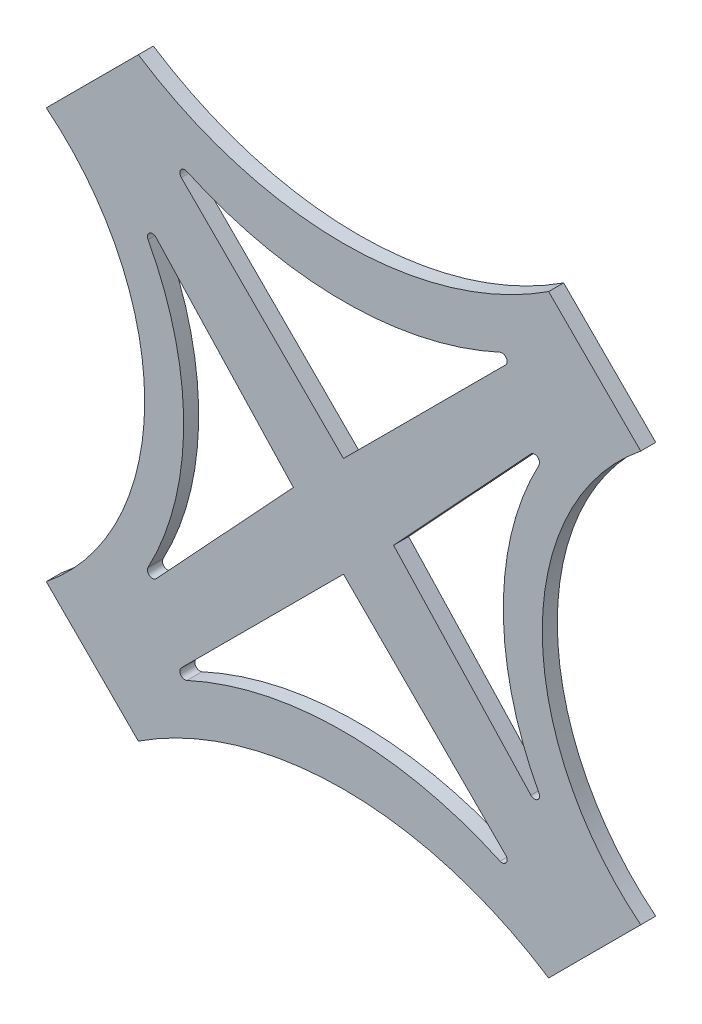
ISO-10303-21;
HEADER;
FILE_DESCRIPTION(('STEP AP214'),'2;1');
FILE_NAME('part.step','',(''),(''),'','','');
FILE_SCHEMA(('AUTOMOTIVE_DESIGN { 1 0 10303 214 1 1 1 1 }'));
ENDSEC;
DATA;
#1=APPLICATION_CONTEXT('core data for automotive mechanical design processes');
#2=APPLICATION_PROTOCOL_DEFINITION('international standard','automotive_design',2000,#1);
#3=PRODUCT_CONTEXT('',#1,'mechanical');
#4=PRODUCT('Part','Part','',(#3));
#5=PRODUCT_RELATED_PRODUCT_CATEGORY('part','',(#4));
#6=PRODUCT_DEFINITION_FORMATION('','',#4);
#7=PRODUCT_DEFINITION_CONTEXT('part definition',#1,'design');
#8=PRODUCT_DEFINITION('design','',#6,#7);
#9=PRODUCT_DEFINITION_SHAPE('','',#8);
#10=(LENGTH_UNIT() NAMED_UNIT(*) SI_UNIT(.MILLI.,.METRE.));
#11=(NAMED_UNIT(*) PLANE_ANGLE_UNIT() SI_UNIT($,.RADIAN.));
#12=(NAMED_UNIT(*) SI_UNIT($,.STERADIAN.) SOLID_ANGLE_UNIT());
#13=UNCERTAINTY_MEASURE_WITH_UNIT(LENGTH_MEASURE(1.E-05),#10,'distance_accuracy_value','');
#14=(GEOMETRIC_REPRESENTATION_CONTEXT(3) GLOBAL_UNCERTAINTY_ASSIGNED_CONTEXT((#13)) GLOBAL_UNIT_ASSIGNED_CONTEXT((#10,
#11,#12)) REPRESENTATION_CONTEXT('',''));
#15=CARTESIAN_POINT('',(0.,0.,0.));
#16=DIRECTION('',(0.,0.,1.));
#17=DIRECTION('',(1.,0.,0.));
#18=AXIS2_PLACEMENT_3D('',#15,#16,#17);
#19=CARTESIAN_POINT('',(-92.1866433585992,0.,3.));
#20=DIRECTION('',(0.,0.,-1.));
#21=DIRECTION('',(-1.,0.,0.));
#22=AXIS2_PLACEMENT_3D('',#19,#20,#21);
#23=PLANE('',#22);
#24=CARTESIAN_POINT('',(-31.6693853715981,-43.0835989339711,3.));
#25=DIRECTION('',(0.,0.,1.));
#26=DIRECTION('',(1.,0.,0.));
#27=AXIS2_PLACEMENT_3D('',#24,#25,#26);
#28=CIRCLE('',#27,1.);
#29=CARTESIAN_POINT('',(-32.3764921527847,-42.3764921527845,3.));
#30=VERTEX_POINT('',#29);
#31=CARTESIAN_POINT('',(-31.2526829324982,-43.9926418797377,3.));
#32=VERTEX_POINT('',#31);
#33=EDGE_CURVE('E272',#30,#32,#28,.T.);
#34=ORIENTED_EDGE('',*,*,#33,.F.);
#35=DIRECTION('',(-0.70710678118655,-0.707106781186545,0.));
#36=VECTOR('',#35,1.);
#37=CARTESIAN_POINT('',(-32.3764921527847,-42.3764921527845,3.));
#38=LINE('',#37,#36);
#39=CARTESIAN_POINT('',(0.,-10.,3.));
#40=VERTEX_POINT('',#39);
#41=EDGE_CURVE('E282',#40,#30,#38,.T.);
#42=ORIENTED_EDGE('',*,*,#41,.F.);
#43=DIRECTION('',(-0.707106781186543,0.707106781186552,0.));
#44=VECTOR('',#43,1.);
#45=CARTESIAN_POINT('',(0.,-10.,3.));
#46=LINE('',#45,#44);
#47=CARTESIAN_POINT('',(32.3764921527839,-42.3764921527843,3.));
#48=VERTEX_POINT('',#47);
#49=EDGE_CURVE('E279',#48,#40,#46,.T.);
#50=ORIENTED_EDGE('',*,*,#49,.F.);
#51=CARTESIAN_POINT('',(31.6693853715977,-43.0835989339711,3.));
#52=DIRECTION('',(0.,0.,1.));
#53=DIRECTION('',(1.,0.,0.));
#54=AXIS2_PLACEMENT_3D('',#51,#52,#53);
#55=CIRCLE('',#54,0.999999999999915);
#56=CARTESIAN_POINT('',(31.2526829324974,-43.9926418797375,3.));
#57=VERTEX_POINT('',#56);
#58=EDGE_CURVE('E277',#57,#48,#55,.T.);
#59=ORIENTED_EDGE('',*,*,#58,.F.);
#60=CARTESIAN_POINT('',(-2.24711807462487E-13,-112.170862812238,3.));
#61=DIRECTION('',(0.,0.,-1.));
#62=DIRECTION('',(1.,0.,0.));
#63=AXIS2_PLACEMENT_3D('',#60,#61,#62);
#64=CIRCLE('',#63,75.0000000000001);
#65=EDGE_CURVE('E274',#32,#57,#64,.T.);
#66=ORIENTED_EDGE('',*,*,#65,.F.);
#67=EDGE_LOOP('',(#34,#42,#50,#59,#66));
#68=FACE_BOUND('',#67,.T.);
#69=CARTESIAN_POINT('',(31.6693853715977,43.0835989339711,3.));
#70=DIRECTION('',(0.,0.,1.));
#71=DIRECTION('',(-1.,0.,0.));
#72=AXIS2_PLACEMENT_3D('',#69,#70,#71);
#73=CIRCLE('',#72,0.999999999999915);
#74=CARTESIAN_POINT('',(32.3764921527839,42.3764921527843,3.));
#75=VERTEX_POINT('',#74);
#76=CARTESIAN_POINT('',(31.2526829324974,43.9926418797376,3.));
#77=VERTEX_POINT('',#76);
#78=EDGE_CURVE('E348',#75,#77,#73,.T.);
#79=ORIENTED_EDGE('',*,*,#78,.F.);
#80=DIRECTION('',(0.707106781186543,0.707106781186552,0.));
#81=VECTOR('',#80,1.);
#82=CARTESIAN_POINT('',(0.,10.,3.));
#83=LINE('',#82,#81);
#84=CARTESIAN_POINT('',(0.,10.,3.));
#85=VERTEX_POINT('',#84);
#86=EDGE_CURVE('E358',#85,#75,#83,.T.);
#87=ORIENTED_EDGE('',*,*,#86,.F.);
#88=DIRECTION('',(0.70710678118655,-0.707106781186545,0.));
#89=VECTOR('',#88,1.);
#90=CARTESIAN_POINT('',(-32.3764921527847,42.3764921527845,3.));
#91=LINE('',#90,#89);
#92=CARTESIAN_POINT('',(-32.3764921527846,42.3764921527845,3.));
#93=VERTEX_POINT('',#92);
#94=EDGE_CURVE('E355',#93,#85,#91,.T.);
#95=ORIENTED_EDGE('',*,*,#94,.F.);
#96=CARTESIAN_POINT('',(-31.6693853715981,43.0835989339711,3.));
#97=DIRECTION('',(0.,0.,1.));
#98=DIRECTION('',(-1.,0.,0.));
#99=AXIS2_PLACEMENT_3D('',#96,#97,#98);
#100=CIRCLE('',#99,1.00000000000001);
#101=CARTESIAN_POINT('',(-31.2526829324981,43.9926418797377,3.));
#102=VERTEX_POINT('',#101);
#103=EDGE_CURVE('E353',#102,#93,#100,.T.);
#104=ORIENTED_EDGE('',*,*,#103,.F.);
#105=CARTESIAN_POINT('',(-2.24711807462487E-13,112.170862812238,3.));
#106=DIRECTION('',(0.,0.,-1.));
#107=DIRECTION('',(-1.,0.,0.));
#108=AXIS2_PLACEMENT_3D('',#105,#106,#107);
#109=CIRCLE('',#108,75.0000000000001);
#110=EDGE_CURVE('E350',#77,#102,#109,.T.);
#111=ORIENTED_EDGE('',*,*,#110,.F.);
#112=EDGE_LOOP('',(#79,#87,#95,#104,#111));
#113=FACE_BOUND('',#112,.T.);
#114=CARTESIAN_POINT('',(-92.1866433585992,0.,3.));
#115=DIRECTION('',(0.,0.,-1.));
#116=DIRECTION('',(-1.,0.,0.));
#117=AXIS2_PLACEMENT_3D('',#114,#115,#116);
#118=CIRCLE('',#117,52.5);
#119=CARTESIAN_POINT('',(-59.3410896032044,40.9563132923542,3.));
#120=VERTEX_POINT('',#119);
#121=CARTESIAN_POINT('',(-59.3410896032044,-40.9563132923542,3.));
#122=VERTEX_POINT('',#121);
#123=EDGE_CURVE('E386',#120,#122,#118,.T.);
#124=ORIENTED_EDGE('',*,*,#123,.T.);
#125=DIRECTION('',(0.707106781186547,-0.707106781186547,0.));
#126=VECTOR('',#125,1.);
#127=CARTESIAN_POINT('',(-59.3410896032044,-40.9563132923542,3.));
#128=LINE('',#127,#126);
#129=CARTESIAN_POINT('',(-40.9563132923542,-59.3410896032044,3.));
#130=VERTEX_POINT('',#129);
#131=EDGE_CURVE('E389',#122,#130,#128,.T.);
#132=ORIENTED_EDGE('',*,*,#131,.T.);
#133=CARTESIAN_POINT('',(0.,-122.170862812237,3.));
#134=DIRECTION('',(0.,0.,-1.));
#135=DIRECTION('',(-1.,0.,0.));
#136=AXIS2_PLACEMENT_3D('',#133,#134,#135);
#137=CIRCLE('',#136,75.);
#138=CARTESIAN_POINT('',(40.9563132923542,-59.3410896032043,3.));
#139=VERTEX_POINT('',#138);
#140=EDGE_CURVE('E392',#130,#139,#137,.T.);
#141=ORIENTED_EDGE('',*,*,#140,.T.);
#142=DIRECTION('',(0.707106781186548,0.707106781186547,0.));
#143=VECTOR('',#142,1.);
#144=CARTESIAN_POINT('',(40.9563132923542,-59.3410896032043,3.));
#145=LINE('',#144,#143);
#146=CARTESIAN_POINT('',(59.3410896032044,-40.9563132923541,3.));
#147=VERTEX_POINT('',#146);
#148=EDGE_CURVE('E394',#139,#147,#145,.T.);
#149=ORIENTED_EDGE('',*,*,#148,.T.);
#150=CARTESIAN_POINT('',(92.1866433585992,0.,3.));
#151=DIRECTION('',(0.,0.,-1.));
#152=DIRECTION('',(1.,0.,0.));
#153=AXIS2_PLACEMENT_3D('',#150,#151,#152);
#154=CIRCLE('',#153,52.5);
#155=CARTESIAN_POINT('',(59.3410896032044,40.9563132923541,3.));
#156=VERTEX_POINT('',#155);
#157=EDGE_CURVE('E396',#147,#156,#154,.T.);
#158=ORIENTED_EDGE('',*,*,#157,.T.);
#159=DIRECTION('',(-0.707106781186548,0.707106781186547,0.));
#160=VECTOR('',#159,1.);
#161=CARTESIAN_POINT('',(40.9563132923542,59.3410896032043,3.));
#162=LINE('',#161,#160);
#163=CARTESIAN_POINT('',(40.9563132923541,59.3410896032043,3.));
#164=VERTEX_POINT('',#163);
#165=EDGE_CURVE('E398',#156,#164,#162,.T.);
#166=ORIENTED_EDGE('',*,*,#165,.T.);
#167=CARTESIAN_POINT('',(0.,122.170862812237,3.));
#168=DIRECTION('',(0.,0.,-1.));
#169=DIRECTION('',(1.,0.,0.));
#170=AXIS2_PLACEMENT_3D('',#167,#168,#169);
#171=CIRCLE('',#170,75.);
#172=CARTESIAN_POINT('',(-40.9563132923542,59.3410896032044,3.));
#173=VERTEX_POINT('',#172);
#174=EDGE_CURVE('E400',#164,#173,#171,.T.);
#175=ORIENTED_EDGE('',*,*,#174,.T.);
#176=DIRECTION('',(-0.707106781186547,-0.707106781186547,0.));
#177=VECTOR('',#176,1.);
#178=CARTESIAN_POINT('',(-59.3410896032044,40.9563132923542,3.));
#179=LINE('',#178,#177);
#180=EDGE_CURVE('E402',#173,#120,#179,.T.);
#181=ORIENTED_EDGE('',*,*,#180,.T.);
#182=EDGE_LOOP('',(#124,#132,#141,#149,#158,#166,#175,#181));
#183=FACE_BOUND('',#182,.T.);
#184=DIRECTION('',(0.680734224272991,0.732530488036812,0.));
#185=VECTOR('',#184,1.);
#186=CARTESIAN_POINT('',(-10.,0.,3.));
#187=LINE('',#186,#185);
#188=CARTESIAN_POINT('',(-37.4101351012741,-29.4957399333564,3.));
#189=VERTEX_POINT('',#188);
#190=CARTESIAN_POINT('',(-10.,0.,3.));
#191=VERTEX_POINT('',#190);
#192=EDGE_CURVE('E310',#189,#191,#187,.T.);
#193=ORIENTED_EDGE('',*,*,#192,.F.);
#194=CARTESIAN_POINT('',(-38.1426655893109,-28.8150057090834,3.));
#195=DIRECTION('',(0.,0.,1.));
#196=DIRECTION('',(-1.,0.,0.));
#197=AXIS2_PLACEMENT_3D('',#194,#195,#196);
#198=CIRCLE('',#197,1.00000000000001);
#199=CARTESIAN_POINT('',(-39.0240621147107,-28.3426285663116,3.));
#200=VERTEX_POINT('',#199);
#201=EDGE_CURVE('E320',#200,#189,#198,.T.);
#202=ORIENTED_EDGE('',*,*,#201,.F.);
#203=CARTESIAN_POINT('',(-91.9078536386937,0.,3.));
#204=DIRECTION('',(0.,0.,-1.));
#205=DIRECTION('',(-1.,0.,0.));
#206=AXIS2_PLACEMENT_3D('',#203,#204,#205);
#207=CIRCLE('',#206,60.);
#208=CARTESIAN_POINT('',(-39.0240621147107,28.3426285663116,3.));
#209=VERTEX_POINT('',#208);
#210=EDGE_CURVE('E317',#209,#200,#207,.T.);
#211=ORIENTED_EDGE('',*,*,#210,.F.);
#212=CARTESIAN_POINT('',(-38.1426655893109,28.8150057090834,3.));
#213=DIRECTION('',(0.,0.,1.));
#214=DIRECTION('',(-1.,0.,0.));
#215=AXIS2_PLACEMENT_3D('',#212,#213,#214);
#216=CIRCLE('',#215,1.);
#217=CARTESIAN_POINT('',(-37.4101351012741,29.4957399333564,3.));
#218=VERTEX_POINT('',#217);
#219=EDGE_CURVE('E315',#218,#209,#216,.T.);
#220=ORIENTED_EDGE('',*,*,#219,.F.);
#221=DIRECTION('',(-0.680734224272991,0.732530488036811,0.));
#222=VECTOR('',#221,1.);
#223=CARTESIAN_POINT('',(-37.4101351012741,29.4957399333564,3.));
#224=LINE('',#223,#222);
#225=EDGE_CURVE('E312',#191,#218,#224,.T.);
#226=ORIENTED_EDGE('',*,*,#225,.F.);
#227=EDGE_LOOP('',(#193,#202,#211,#220,#226));
#228=FACE_BOUND('',#227,.T.);
#229=DIRECTION('',(-0.680734224272991,-0.732530488036811,0.));
#230=VECTOR('',#229,1.);
#231=CARTESIAN_POINT('',(37.4101351012741,29.4957399333564,3.));
#232=LINE('',#231,#230);
#233=CARTESIAN_POINT('',(37.4101351012741,29.4957399333564,3.));
#234=VERTEX_POINT('',#233);
#235=CARTESIAN_POINT('',(10.,0.,3.));
#236=VERTEX_POINT('',#235);
#237=EDGE_CURVE('E228',#234,#236,#232,.T.);
#238=ORIENTED_EDGE('',*,*,#237,.F.);
#239=CARTESIAN_POINT('',(38.1426655893109,28.8150057090834,3.));
#240=DIRECTION('',(0.,0.,1.));
#241=DIRECTION('',(1.,0.,0.));
#242=AXIS2_PLACEMENT_3D('',#239,#240,#241);
#243=CIRCLE('',#242,1.);
#244=CARTESIAN_POINT('',(39.0240621147107,28.3426285663116,3.));
#245=VERTEX_POINT('',#244);
#246=EDGE_CURVE('E255',#245,#234,#243,.T.);
#247=ORIENTED_EDGE('',*,*,#246,.F.);
#248=CARTESIAN_POINT('',(91.9078536386937,0.,3.));
#249=DIRECTION('',(0.,0.,-1.));
#250=DIRECTION('',(1.,0.,0.));
#251=AXIS2_PLACEMENT_3D('',#248,#249,#250);
#252=CIRCLE('',#251,60.);
#253=CARTESIAN_POINT('',(39.0240621147107,-28.3426285663116,3.));
#254=VERTEX_POINT('',#253);
#255=EDGE_CURVE('E251',#254,#245,#252,.T.);
#256=ORIENTED_EDGE('',*,*,#255,.F.);
#257=CARTESIAN_POINT('',(38.1426655893109,-28.8150057090834,3.));
#258=DIRECTION('',(0.,0.,1.));
#259=DIRECTION('',(1.,0.,0.));
#260=AXIS2_PLACEMENT_3D('',#257,#258,#259);
#261=CIRCLE('',#260,1.00000000000001);
#262=CARTESIAN_POINT('',(37.4101351012741,-29.4957399333564,3.));
#263=VERTEX_POINT('',#262);
#264=EDGE_CURVE('E249',#263,#254,#261,.T.);
#265=ORIENTED_EDGE('',*,*,#264,.F.);
#266=DIRECTION('',(0.680734224272991,-0.732530488036812,0.));
#267=VECTOR('',#266,1.);
#268=CARTESIAN_POINT('',(10.,0.,3.));
#269=LINE('',#268,#267);
#270=EDGE_CURVE('E236',#236,#263,#269,.T.);
#271=ORIENTED_EDGE('',*,*,#270,.F.);
#272=EDGE_LOOP('',(#238,#247,#256,#265,#271));
#273=FACE_BOUND('',#272,.T.);
#274=ADVANCED_FACE('F43',(#68,#113,#183,#228,#273),#23,.F.);
#275=CARTESIAN_POINT('',(-92.1866433585992,0.,3.));
#276=DIRECTION('',(0.,0.,-1.));
#277=DIRECTION('',(-1.,0.,0.));
#278=AXIS2_PLACEMENT_3D('',#275,#276,#277);
#279=CYLINDRICAL_SURFACE('',#278,52.5);
#280=CARTESIAN_POINT('',(-92.1866433585992,0.,0.));
#281=DIRECTION('',(0.,0.,-1.));
#282=DIRECTION('',(-1.,0.,0.));
#283=AXIS2_PLACEMENT_3D('',#280,#281,#282);
#284=CIRCLE('',#283,52.5);
#285=CARTESIAN_POINT('',(-59.3410896032044,40.9563132923542,0.));
#286=VERTEX_POINT('',#285);
#287=CARTESIAN_POINT('',(-59.3410896032044,-40.9563132923542,0.));
#288=VERTEX_POINT('',#287);
#289=EDGE_CURVE('E385',#286,#288,#284,.T.);
#290=ORIENTED_EDGE('',*,*,#289,.T.);
#291=DIRECTION('',(0.,0.,-1.));
#292=VECTOR('',#291,1.);
#293=CARTESIAN_POINT('',(-59.3410896032044,-40.9563132923542,3.));
#294=LINE('',#293,#292);
#295=EDGE_CURVE('E11',#122,#288,#294,.T.);
#296=ORIENTED_EDGE('',*,*,#295,.F.);
#297=ORIENTED_EDGE('',*,*,#123,.F.);
#298=DIRECTION('',(0.,0.,-1.));
#299=VECTOR('',#298,1.);
#300=CARTESIAN_POINT('',(-59.3410896032044,40.9563132923542,3.));
#301=LINE('',#300,#299);
#302=EDGE_CURVE('E404',#120,#286,#301,.T.);
#303=ORIENTED_EDGE('',*,*,#302,.T.);
#304=EDGE_LOOP('',(#290,#296,#297,#303));
#305=FACE_BOUND('',#304,.T.);
#306=ADVANCED_FACE('F466',(#305),#279,.F.);
#307=CARTESIAN_POINT('',(-59.3410896032044,-40.9563132923542,3.));
#308=DIRECTION('',(0.707106781186548,0.707106781186548,0.));
#309=DIRECTION('',(-0.707106781186548,0.707106781186548,0.));
#310=AXIS2_PLACEMENT_3D('',#307,#308,#309);
#311=PLANE('',#310);
#312=DIRECTION('',(0.707106781186547,-0.707106781186547,0.));
#313=VECTOR('',#312,1.);
#314=CARTESIAN_POINT('',(-59.3410896032044,-40.9563132923542,0.));
#315=LINE('',#314,#313);
#316=CARTESIAN_POINT('',(-40.9563132923542,-59.3410896032044,0.));
#317=VERTEX_POINT('',#316);
#318=EDGE_CURVE('E407',#288,#317,#315,.T.);
#319=ORIENTED_EDGE('',*,*,#318,.T.);
#320=DIRECTION('',(0.,0.,-1.));
#321=VECTOR('',#320,1.);
#322=CARTESIAN_POINT('',(-40.9563132923542,-59.3410896032044,3.));
#323=LINE('',#322,#321);
#324=EDGE_CURVE('E51',#130,#317,#323,.T.);
#325=ORIENTED_EDGE('',*,*,#324,.F.);
#326=ORIENTED_EDGE('',*,*,#131,.F.);
#327=ORIENTED_EDGE('',*,*,#295,.T.);
#328=EDGE_LOOP('',(#319,#325,#326,#327));
#329=FACE_BOUND('',#328,.T.);
#330=ADVANCED_FACE('F464',(#329),#311,.F.);
#331=CARTESIAN_POINT('',(0.,-122.170862812237,3.));
#332=DIRECTION('',(0.,0.,-1.));
#333=DIRECTION('',(-1.,0.,0.));
#334=AXIS2_PLACEMENT_3D('',#331,#332,#333);
#335=CYLINDRICAL_SURFACE('',#334,75.);
#336=CARTESIAN_POINT('',(0.,-122.170862812237,0.));
#337=DIRECTION('',(0.,0.,-1.));
#338=DIRECTION('',(-1.,0.,0.));
#339=AXIS2_PLACEMENT_3D('',#336,#337,#338);
#340=CIRCLE('',#339,75.);
#341=CARTESIAN_POINT('',(40.9563132923542,-59.3410896032043,0.));
#342=VERTEX_POINT('',#341);
#343=EDGE_CURVE('E409',#317,#342,#340,.T.);
#344=ORIENTED_EDGE('',*,*,#343,.T.);
#345=DIRECTION('',(0.,0.,-1.));
#346=VECTOR('',#345,1.);
#347=CARTESIAN_POINT('',(40.9563132923542,-59.3410896032043,3.));
#348=LINE('',#347,#346);
#349=EDGE_CURVE('E434',#139,#342,#348,.T.);
#350=ORIENTED_EDGE('',*,*,#349,.F.);
#351=ORIENTED_EDGE('',*,*,#140,.F.);
#352=ORIENTED_EDGE('',*,*,#324,.T.);
#353=EDGE_LOOP('',(#344,#350,#351,#352));
#354=FACE_BOUND('',#353,.T.);
#355=ADVANCED_FACE('F441',(#354),#335,.F.);
#356=CARTESIAN_POINT('',(40.9563132923542,-59.3410896032043,3.));
#357=DIRECTION('',(-0.707106781186547,0.707106781186548,0.));
#358=DIRECTION('',(-0.707106781186548,-0.707106781186547,0.));
#359=AXIS2_PLACEMENT_3D('',#356,#357,#358);
#360=PLANE('',#359);
#361=DIRECTION('',(0.707106781186548,0.707106781186547,0.));
#362=VECTOR('',#361,1.);
#363=CARTESIAN_POINT('',(40.9563132923542,-59.3410896032043,0.));
#364=LINE('',#363,#362);
#365=CARTESIAN_POINT('',(59.3410896032044,-40.9563132923541,0.));
#366=VERTEX_POINT('',#365);
#367=EDGE_CURVE('E411',#342,#366,#364,.T.);
#368=ORIENTED_EDGE('',*,*,#367,.T.);
#369=DIRECTION('',(0.,0.,-1.));
#370=VECTOR('',#369,1.);
#371=CARTESIAN_POINT('',(59.3410896032044,-40.9563132923541,3.));
#372=LINE('',#371,#370);
#373=EDGE_CURVE('E431',#147,#366,#372,.T.);
#374=ORIENTED_EDGE('',*,*,#373,.F.);
#375=ORIENTED_EDGE('',*,*,#148,.F.);
#376=ORIENTED_EDGE('',*,*,#349,.T.);
#377=EDGE_LOOP('',(#368,#374,#375,#376));
#378=FACE_BOUND('',#377,.T.);
#379=ADVANCED_FACE('F452',(#378),#360,.F.);
#380=CARTESIAN_POINT('',(92.1866433585992,0.,3.));
#381=DIRECTION('',(0.,0.,-1.));
#382=DIRECTION('',(-1.,0.,0.));
#383=AXIS2_PLACEMENT_3D('',#380,#381,#382);
#384=CYLINDRICAL_SURFACE('',#383,52.5);
#385=CARTESIAN_POINT('',(92.1866433585992,0.,0.));
#386=DIRECTION('',(0.,0.,-1.));
#387=DIRECTION('',(1.,0.,0.));
#388=AXIS2_PLACEMENT_3D('',#385,#386,#387);
#389=CIRCLE('',#388,52.5);
#390=CARTESIAN_POINT('',(59.3410896032044,40.9563132923541,0.));
#391=VERTEX_POINT('',#390);
#392=EDGE_CURVE('E413',#366,#391,#389,.T.);
#393=ORIENTED_EDGE('',*,*,#392,.T.);
#394=DIRECTION('',(0.,0.,-1.));
#395=VECTOR('',#394,1.);
#396=CARTESIAN_POINT('',(59.3410896032044,40.9563132923541,3.));
#397=LINE('',#396,#395);
#398=EDGE_CURVE('E428',#156,#391,#397,.T.);
#399=ORIENTED_EDGE('',*,*,#398,.F.);
#400=ORIENTED_EDGE('',*,*,#157,.F.);
#401=ORIENTED_EDGE('',*,*,#373,.T.);
#402=EDGE_LOOP('',(#393,#399,#400,#401));
#403=FACE_BOUND('',#402,.T.);
#404=ADVANCED_FACE('F456',(#403),#384,.F.);
#405=CARTESIAN_POINT('',(40.9563132923542,59.3410896032043,3.));
#406=DIRECTION('',(-0.707106781186547,-0.707106781186548,0.));
#407=DIRECTION('',(0.707106781186548,-0.707106781186547,0.));
#408=AXIS2_PLACEMENT_3D('',#405,#406,#407);
#409=PLANE('',#408);
#410=DIRECTION('',(-0.707106781186548,0.707106781186547,0.));
#411=VECTOR('',#410,1.);
#412=CARTESIAN_POINT('',(40.9563132923542,59.3410896032043,0.));
#413=LINE('',#412,#411);
#414=CARTESIAN_POINT('',(40.9563132923541,59.3410896032043,0.));
#415=VERTEX_POINT('',#414);
#416=EDGE_CURVE('E415',#391,#415,#413,.T.);
#417=ORIENTED_EDGE('',*,*,#416,.T.);
#418=DIRECTION('',(0.,0.,-1.));
#419=VECTOR('',#418,1.);
#420=CARTESIAN_POINT('',(40.9563132923541,59.3410896032043,3.));
#421=LINE('',#420,#419);
#422=EDGE_CURVE('E425',#164,#415,#421,.T.);
#423=ORIENTED_EDGE('',*,*,#422,.F.);
#424=ORIENTED_EDGE('',*,*,#165,.F.);
#425=ORIENTED_EDGE('',*,*,#398,.T.);
#426=EDGE_LOOP('',(#417,#423,#424,#425));
#427=FACE_BOUND('',#426,.T.);
#428=ADVANCED_FACE('F478',(#427),#409,.F.);
#429=CARTESIAN_POINT('',(0.,122.170862812237,3.));
#430=DIRECTION('',(0.,0.,-1.));
#431=DIRECTION('',(-1.,0.,0.));
#432=AXIS2_PLACEMENT_3D('',#429,#430,#431);
#433=CYLINDRICAL_SURFACE('',#432,75.);
#434=CARTESIAN_POINT('',(0.,122.170862812237,0.));
#435=DIRECTION('',(0.,0.,-1.));
#436=DIRECTION('',(1.,0.,0.));
#437=AXIS2_PLACEMENT_3D('',#434,#435,#436);
#438=CIRCLE('',#437,75.);
#439=CARTESIAN_POINT('',(-40.9563132923542,59.3410896032044,0.));
#440=VERTEX_POINT('',#439);
#441=EDGE_CURVE('E417',#415,#440,#438,.T.);
#442=ORIENTED_EDGE('',*,*,#441,.T.);
#443=DIRECTION('',(0.,0.,-1.));
#444=VECTOR('',#443,1.);
#445=CARTESIAN_POINT('',(-40.9563132923542,59.3410896032044,3.));
#446=LINE('',#445,#444);
#447=EDGE_CURVE('E422',#173,#440,#446,.T.);
#448=ORIENTED_EDGE('',*,*,#447,.F.);
#449=ORIENTED_EDGE('',*,*,#174,.F.);
#450=ORIENTED_EDGE('',*,*,#422,.T.);
#451=EDGE_LOOP('',(#442,#448,#449,#450));
#452=FACE_BOUND('',#451,.T.);
#453=ADVANCED_FACE('F476',(#452),#433,.F.);
#454=CARTESIAN_POINT('',(-59.3410896032044,40.9563132923542,3.));
#455=DIRECTION('',(0.707106781186548,-0.707106781186548,0.));
#456=DIRECTION('',(0.707106781186548,0.707106781186548,0.));
#457=AXIS2_PLACEMENT_3D('',#454,#455,#456);
#458=PLANE('',#457);
#459=DIRECTION('',(-0.707106781186547,-0.707106781186547,0.));
#460=VECTOR('',#459,1.);
#461=CARTESIAN_POINT('',(-59.3410896032044,40.9563132923542,0.));
#462=LINE('',#461,#460);
#463=EDGE_CURVE('E390',#440,#286,#462,.T.);
#464=ORIENTED_EDGE('',*,*,#463,.T.);
#465=ORIENTED_EDGE('',*,*,#302,.F.);
#466=ORIENTED_EDGE('',*,*,#180,.F.);
#467=ORIENTED_EDGE('',*,*,#447,.T.);
#468=EDGE_LOOP('',(#464,#465,#466,#467));
#469=FACE_BOUND('',#468,.T.);
#470=ADVANCED_FACE('F471',(#469),#458,.F.);
#471=CARTESIAN_POINT('',(31.6693853715977,43.0835989339711,3.));
#472=DIRECTION('',(0.,0.,-1.));
#473=DIRECTION('',(-1.,0.,0.));
#474=AXIS2_PLACEMENT_3D('',#471,#472,#473);
#475=CYLINDRICAL_SURFACE('',#474,0.999999999999915);
#476=CARTESIAN_POINT('',(31.6693853715977,43.0835989339711,0.));
#477=DIRECTION('',(0.,0.,1.));
#478=DIRECTION('',(-1.,0.,0.));
#479=AXIS2_PLACEMENT_3D('',#476,#477,#478);
#480=CIRCLE('',#479,0.999999999999915);
#481=CARTESIAN_POINT('',(32.3764921527839,42.3764921527843,0.));
#482=VERTEX_POINT('',#481);
#483=CARTESIAN_POINT('',(31.2526829324974,43.9926418797376,0.));
#484=VERTEX_POINT('',#483);
#485=EDGE_CURVE('E347',#482,#484,#480,.T.);
#486=ORIENTED_EDGE('',*,*,#485,.F.);
#487=DIRECTION('',(0.,0.,-1.));
#488=VECTOR('',#487,1.);
#489=CARTESIAN_POINT('',(32.3764921527839,42.3764921527843,3.));
#490=LINE('',#489,#488);
#491=EDGE_CURVE('E360',#75,#482,#490,.T.);
#492=ORIENTED_EDGE('',*,*,#491,.F.);
#493=ORIENTED_EDGE('',*,*,#78,.T.);
#494=DIRECTION('',(0.,0.,-1.));
#495=VECTOR('',#494,1.);
#496=CARTESIAN_POINT('',(31.2526829324974,43.9926418797376,3.));
#497=LINE('',#496,#495);
#498=EDGE_CURVE('E382',#77,#484,#497,.T.);
#499=ORIENTED_EDGE('',*,*,#498,.T.);
#500=EDGE_LOOP('',(#486,#492,#493,#499));
#501=FACE_BOUND('',#500,.T.);
#502=ADVANCED_FACE('F497',(#501),#475,.F.);
#503=CARTESIAN_POINT('',(-2.24711807462487E-13,112.170862812238,3.));
#504=DIRECTION('',(0.,0.,-1.));
#505=DIRECTION('',(-1.,0.,0.));
#506=AXIS2_PLACEMENT_3D('',#503,#504,#505);
#507=CYLINDRICAL_SURFACE('',#506,75.0000000000001);
#508=CARTESIAN_POINT('',(-2.24711807462487E-13,112.170862812238,0.));
#509=DIRECTION('',(0.,0.,-1.));
#510=DIRECTION('',(-1.,0.,0.));
#511=AXIS2_PLACEMENT_3D('',#508,#509,#510);
#512=CIRCLE('',#511,75.0000000000001);
#513=CARTESIAN_POINT('',(-31.2526829324981,43.9926418797377,0.));
#514=VERTEX_POINT('',#513);
#515=EDGE_CURVE('E363',#484,#514,#512,.T.);
#516=ORIENTED_EDGE('',*,*,#515,.F.);
#517=ORIENTED_EDGE('',*,*,#498,.F.);
#518=ORIENTED_EDGE('',*,*,#110,.T.);
#519=DIRECTION('',(0.,0.,-1.));
#520=VECTOR('',#519,1.);
#521=CARTESIAN_POINT('',(-31.2526829324981,43.9926418797377,3.));
#522=LINE('',#521,#520);
#523=EDGE_CURVE('E380',#102,#514,#522,.T.);
#524=ORIENTED_EDGE('',*,*,#523,.T.);
#525=EDGE_LOOP('',(#516,#517,#518,#524));
#526=FACE_BOUND('',#525,.T.);
#527=ADVANCED_FACE('F503',(#526),#507,.T.);
#528=CARTESIAN_POINT('',(-31.6693853715981,43.0835989339711,3.));
#529=DIRECTION('',(0.,0.,-1.));
#530=DIRECTION('',(-1.,0.,0.));
#531=AXIS2_PLACEMENT_3D('',#528,#529,#530);
#532=CYLINDRICAL_SURFACE('',#531,1.00000000000001);
#533=CARTESIAN_POINT('',(-31.6693853715981,43.0835989339711,0.));
#534=DIRECTION('',(0.,0.,1.));
#535=DIRECTION('',(-1.,0.,0.));
#536=AXIS2_PLACEMENT_3D('',#533,#534,#535);
#537=CIRCLE('',#536,1.00000000000001);
#538=CARTESIAN_POINT('',(-32.3764921527846,42.3764921527845,0.));
#539=VERTEX_POINT('',#538);
#540=EDGE_CURVE('E366',#514,#539,#537,.T.);
#541=ORIENTED_EDGE('',*,*,#540,.F.);
#542=ORIENTED_EDGE('',*,*,#523,.F.);
#543=ORIENTED_EDGE('',*,*,#103,.T.);
#544=DIRECTION('',(0.,0.,-1.));
#545=VECTOR('',#544,1.);
#546=CARTESIAN_POINT('',(-32.3764921527846,42.3764921527845,3.));
#547=LINE('',#546,#545);
#548=EDGE_CURVE('E378',#93,#539,#547,.T.);
#549=ORIENTED_EDGE('',*,*,#548,.T.);
#550=EDGE_LOOP('',(#541,#542,#543,#549));
#551=FACE_BOUND('',#550,.T.);
#552=ADVANCED_FACE('F508',(#551),#532,.F.);
#553=CARTESIAN_POINT('',(-32.3764921527847,42.3764921527845,3.));
#554=DIRECTION('',(0.707106781186545,0.707106781186549,0.));
#555=DIRECTION('',(-0.70710678118655,0.707106781186545,0.));
#556=AXIS2_PLACEMENT_3D('',#553,#554,#555);
#557=PLANE('',#556);
#558=DIRECTION('',(0.70710678118655,-0.707106781186545,0.));
#559=VECTOR('',#558,1.);
#560=CARTESIAN_POINT('',(-32.3764921527847,42.3764921527845,0.));
#561=LINE('',#560,#559);
#562=CARTESIAN_POINT('',(0.,10.,0.));
#563=VERTEX_POINT('',#562);
#564=EDGE_CURVE('E369',#539,#563,#561,.T.);
#565=ORIENTED_EDGE('',*,*,#564,.F.);
#566=ORIENTED_EDGE('',*,*,#548,.F.);
#567=ORIENTED_EDGE('',*,*,#94,.T.);
#568=DIRECTION('',(0.,0.,-1.));
#569=VECTOR('',#568,1.);
#570=CARTESIAN_POINT('',(0.,10.,3.));
#571=LINE('',#570,#569);
#572=EDGE_CURVE('E376',#85,#563,#571,.T.);
#573=ORIENTED_EDGE('',*,*,#572,.T.);
#574=EDGE_LOOP('',(#565,#566,#567,#573));
#575=FACE_BOUND('',#574,.T.);
#576=ADVANCED_FACE('F522',(#575),#557,.T.);
#577=CARTESIAN_POINT('',(0.,10.,3.));
#578=DIRECTION('',(-0.707106781186552,0.707106781186543,0.));
#579=DIRECTION('',(-0.707106781186543,-0.707106781186552,0.));
#580=AXIS2_PLACEMENT_3D('',#577,#578,#579);
#581=PLANE('',#580);
#582=DIRECTION('',(0.707106781186543,0.707106781186552,0.));
#583=VECTOR('',#582,1.);
#584=CARTESIAN_POINT('',(0.,10.,0.));
#585=LINE('',#584,#583);
#586=EDGE_CURVE('E351',#563,#482,#585,.T.);
#587=ORIENTED_EDGE('',*,*,#586,.F.);
#588=ORIENTED_EDGE('',*,*,#572,.F.);
#589=ORIENTED_EDGE('',*,*,#86,.T.);
#590=ORIENTED_EDGE('',*,*,#491,.T.);
#591=EDGE_LOOP('',(#587,#588,#589,#590));
#592=FACE_BOUND('',#591,.T.);
#593=ADVANCED_FACE('F515',(#592),#581,.T.);
#594=CARTESIAN_POINT('',(-10.,0.,3.));
#595=DIRECTION('',(-0.732530488036811,0.680734224272991,0.));
#596=DIRECTION('',(-0.680734224272991,-0.732530488036811,0.));
#597=AXIS2_PLACEMENT_3D('',#594,#595,#596);
#598=PLANE('',#597);
#599=DIRECTION('',(0.680734224272991,0.732530488036812,0.));
#600=VECTOR('',#599,1.);
#601=CARTESIAN_POINT('',(-10.,0.,0.));
#602=LINE('',#601,#600);
#603=CARTESIAN_POINT('',(-37.4101351012741,-29.4957399333564,0.));
#604=VERTEX_POINT('',#603);
#605=CARTESIAN_POINT('',(-10.,0.,0.));
#606=VERTEX_POINT('',#605);
#607=EDGE_CURVE('E309',#604,#606,#602,.T.);
#608=ORIENTED_EDGE('',*,*,#607,.F.);
#609=DIRECTION('',(0.,0.,-1.));
#610=VECTOR('',#609,1.);
#611=CARTESIAN_POINT('',(-37.4101351012741,-29.4957399333564,3.));
#612=LINE('',#611,#610);
#613=EDGE_CURVE('E322',#189,#604,#612,.T.);
#614=ORIENTED_EDGE('',*,*,#613,.F.);
#615=ORIENTED_EDGE('',*,*,#192,.T.);
#616=DIRECTION('',(0.,0.,-1.));
#617=VECTOR('',#616,1.);
#618=CARTESIAN_POINT('',(-10.,0.,3.));
#619=LINE('',#618,#617);
#620=EDGE_CURVE('E344',#191,#606,#619,.T.);
#621=ORIENTED_EDGE('',*,*,#620,.T.);
#622=EDGE_LOOP('',(#608,#614,#615,#621));
#623=FACE_BOUND('',#622,.T.);
#624=ADVANCED_FACE('F537',(#623),#598,.T.);
#625=CARTESIAN_POINT('',(-37.4101351012741,29.4957399333564,3.));
#626=DIRECTION('',(-0.732530488036811,-0.680734224272991,0.));
#627=DIRECTION('',(0.680734224272991,-0.732530488036811,0.));
#628=AXIS2_PLACEMENT_3D('',#625,#626,#627);
#629=PLANE('',#628);
#630=DIRECTION('',(-0.680734224272991,0.732530488036811,0.));
#631=VECTOR('',#630,1.);
#632=CARTESIAN_POINT('',(-37.4101351012741,29.4957399333564,0.));
#633=LINE('',#632,#631);
#634=CARTESIAN_POINT('',(-37.4101351012741,29.4957399333564,0.));
#635=VERTEX_POINT('',#634);
#636=EDGE_CURVE('E325',#606,#635,#633,.T.);
#637=ORIENTED_EDGE('',*,*,#636,.F.);
#638=ORIENTED_EDGE('',*,*,#620,.F.);
#639=ORIENTED_EDGE('',*,*,#225,.T.);
#640=DIRECTION('',(0.,0.,-1.));
#641=VECTOR('',#640,1.);
#642=CARTESIAN_POINT('',(-37.4101351012741,29.4957399333564,3.));
#643=LINE('',#642,#641);
#644=EDGE_CURVE('E342',#218,#635,#643,.T.);
#645=ORIENTED_EDGE('',*,*,#644,.T.);
#646=EDGE_LOOP('',(#637,#638,#639,#645));
#647=FACE_BOUND('',#646,.T.);
#648=ADVANCED_FACE('F540',(#647),#629,.T.);
#649=CARTESIAN_POINT('',(-38.1426655893109,28.8150057090834,3.));
#650=DIRECTION('',(0.,0.,-1.));
#651=DIRECTION('',(-1.,0.,0.));
#652=AXIS2_PLACEMENT_3D('',#649,#650,#651);
#653=CYLINDRICAL_SURFACE('',#652,1.);
#654=CARTESIAN_POINT('',(-38.1426655893109,28.8150057090834,0.));
#655=DIRECTION('',(0.,0.,1.));
#656=DIRECTION('',(-1.,0.,0.));
#657=AXIS2_PLACEMENT_3D('',#654,#655,#656);
#658=CIRCLE('',#657,1.);
#659=CARTESIAN_POINT('',(-39.0240621147107,28.3426285663116,0.));
#660=VERTEX_POINT('',#659);
#661=EDGE_CURVE('E328',#635,#660,#658,.T.);
#662=ORIENTED_EDGE('',*,*,#661,.F.);
#663=ORIENTED_EDGE('',*,*,#644,.F.);
#664=ORIENTED_EDGE('',*,*,#219,.T.);
#665=DIRECTION('',(0.,0.,-1.));
#666=VECTOR('',#665,1.);
#667=CARTESIAN_POINT('',(-39.0240621147107,28.3426285663116,3.));
#668=LINE('',#667,#666);
#669=EDGE_CURVE('E340',#209,#660,#668,.T.);
#670=ORIENTED_EDGE('',*,*,#669,.T.);
#671=EDGE_LOOP('',(#662,#663,#664,#670));
#672=FACE_BOUND('',#671,.T.);
#673=ADVANCED_FACE('F544',(#672),#653,.F.);
#674=CARTESIAN_POINT('',(-91.9078536386937,0.,3.));
#675=DIRECTION('',(0.,0.,-1.));
#676=DIRECTION('',(-1.,0.,0.));
#677=AXIS2_PLACEMENT_3D('',#674,#675,#676);
#678=CYLINDRICAL_SURFACE('',#677,60.);
#679=CARTESIAN_POINT('',(-91.9078536386937,0.,0.));
#680=DIRECTION('',(0.,0.,-1.));
#681=DIRECTION('',(-1.,0.,0.));
#682=AXIS2_PLACEMENT_3D('',#679,#680,#681);
#683=CIRCLE('',#682,60.);
#684=CARTESIAN_POINT('',(-39.0240621147107,-28.3426285663116,0.));
#685=VERTEX_POINT('',#684);
#686=EDGE_CURVE('E331',#660,#685,#683,.T.);
#687=ORIENTED_EDGE('',*,*,#686,.F.);
#688=ORIENTED_EDGE('',*,*,#669,.F.);
#689=ORIENTED_EDGE('',*,*,#210,.T.);
#690=DIRECTION('',(0.,0.,-1.));
#691=VECTOR('',#690,1.);
#692=CARTESIAN_POINT('',(-39.0240621147107,-28.3426285663116,3.));
#693=LINE('',#692,#691);
#694=EDGE_CURVE('E338',#200,#685,#693,.T.);
#695=ORIENTED_EDGE('',*,*,#694,.T.);
#696=EDGE_LOOP('',(#687,#688,#689,#695));
#697=FACE_BOUND('',#696,.T.);
#698=ADVANCED_FACE('F548',(#697),#678,.T.);
#699=CARTESIAN_POINT('',(-38.1426655893109,-28.8150057090834,3.));
#700=DIRECTION('',(0.,0.,-1.));
#701=DIRECTION('',(-1.,0.,0.));
#702=AXIS2_PLACEMENT_3D('',#699,#700,#701);
#703=CYLINDRICAL_SURFACE('',#702,1.00000000000001);
#704=CARTESIAN_POINT('',(-38.1426655893109,-28.8150057090834,0.));
#705=DIRECTION('',(0.,0.,1.));
#706=DIRECTION('',(-1.,0.,0.));
#707=AXIS2_PLACEMENT_3D('',#704,#705,#706);
#708=CIRCLE('',#707,1.00000000000001);
#709=EDGE_CURVE('E313',#685,#604,#708,.T.);
#710=ORIENTED_EDGE('',*,*,#709,.F.);
#711=ORIENTED_EDGE('',*,*,#694,.F.);
#712=ORIENTED_EDGE('',*,*,#201,.T.);
#713=ORIENTED_EDGE('',*,*,#613,.T.);
#714=EDGE_LOOP('',(#710,#711,#712,#713));
#715=FACE_BOUND('',#714,.T.);
#716=ADVANCED_FACE('F552',(#715),#703,.F.);
#717=CARTESIAN_POINT('',(-31.6693853715981,-43.0835989339711,3.));
#718=DIRECTION('',(0.,0.,-1.));
#719=DIRECTION('',(-1.,0.,0.));
#720=AXIS2_PLACEMENT_3D('',#717,#718,#719);
#721=CYLINDRICAL_SURFACE('',#720,1.);
#722=CARTESIAN_POINT('',(-31.6693853715981,-43.0835989339711,0.));
#723=DIRECTION('',(0.,0.,1.));
#724=DIRECTION('',(1.,0.,0.));
#725=AXIS2_PLACEMENT_3D('',#722,#723,#724);
#726=CIRCLE('',#725,1.);
#727=CARTESIAN_POINT('',(-32.3764921527847,-42.3764921527845,0.));
#728=VERTEX_POINT('',#727);
#729=CARTESIAN_POINT('',(-31.2526829324982,-43.9926418797377,0.));
#730=VERTEX_POINT('',#729);
#731=EDGE_CURVE('E244',#728,#730,#726,.T.);
#732=ORIENTED_EDGE('',*,*,#731,.F.);
#733=DIRECTION('',(0.,0.,-1.));
#734=VECTOR('',#733,1.);
#735=CARTESIAN_POINT('',(-32.3764921527847,-42.3764921527845,3.));
#736=LINE('',#735,#734);
#737=EDGE_CURVE('E284',#30,#728,#736,.T.);
#738=ORIENTED_EDGE('',*,*,#737,.F.);
#739=ORIENTED_EDGE('',*,*,#33,.T.);
#740=DIRECTION('',(0.,0.,-1.));
#741=VECTOR('',#740,1.);
#742=CARTESIAN_POINT('',(-31.2526829324982,-43.9926418797377,3.));
#743=LINE('',#742,#741);
#744=EDGE_CURVE('E306',#32,#730,#743,.T.);
#745=ORIENTED_EDGE('',*,*,#744,.T.);
#746=EDGE_LOOP('',(#732,#738,#739,#745));
#747=FACE_BOUND('',#746,.T.);
#748=ADVANCED_FACE('F556',(#747),#721,.F.);
#749=CARTESIAN_POINT('',(-2.24711807462487E-13,-112.170862812238,3.));
#750=DIRECTION('',(0.,0.,-1.));
#751=DIRECTION('',(-1.,0.,0.));
#752=AXIS2_PLACEMENT_3D('',#749,#750,#751);
#753=CYLINDRICAL_SURFACE('',#752,75.0000000000001);
#754=CARTESIAN_POINT('',(-2.24711807462487E-13,-112.170862812238,0.));
#755=DIRECTION('',(0.,0.,-1.));
#756=DIRECTION('',(1.,0.,0.));
#757=AXIS2_PLACEMENT_3D('',#754,#755,#756);
#758=CIRCLE('',#757,75.0000000000001);
#759=CARTESIAN_POINT('',(31.2526829324974,-43.9926418797375,0.));
#760=VERTEX_POINT('',#759);
#761=EDGE_CURVE('E287',#730,#760,#758,.T.);
#762=ORIENTED_EDGE('',*,*,#761,.F.);
#763=ORIENTED_EDGE('',*,*,#744,.F.);
#764=ORIENTED_EDGE('',*,*,#65,.T.);
#765=DIRECTION('',(0.,0.,-1.));
#766=VECTOR('',#765,1.);
#767=CARTESIAN_POINT('',(31.2526829324974,-43.9926418797375,3.));
#768=LINE('',#767,#766);
#769=EDGE_CURVE('E304',#57,#760,#768,.T.);
#770=ORIENTED_EDGE('',*,*,#769,.T.);
#771=EDGE_LOOP('',(#762,#763,#764,#770));
#772=FACE_BOUND('',#771,.T.);
#773=ADVANCED_FACE('F560',(#772),#753,.T.);
#774=CARTESIAN_POINT('',(31.6693853715977,-43.0835989339711,3.));
#775=DIRECTION('',(0.,0.,-1.));
#776=DIRECTION('',(-1.,0.,0.));
#777=AXIS2_PLACEMENT_3D('',#774,#775,#776);
#778=CYLINDRICAL_SURFACE('',#777,0.999999999999915);
#779=CARTESIAN_POINT('',(31.6693853715977,-43.0835989339711,0.));
#780=DIRECTION('',(0.,0.,1.));
#781=DIRECTION('',(1.,0.,0.));
#782=AXIS2_PLACEMENT_3D('',#779,#780,#781);
#783=CIRCLE('',#782,0.999999999999915);
#784=CARTESIAN_POINT('',(32.3764921527839,-42.3764921527843,0.));
#785=VERTEX_POINT('',#784);
#786=EDGE_CURVE('E290',#760,#785,#783,.T.);
#787=ORIENTED_EDGE('',*,*,#786,.F.);
#788=ORIENTED_EDGE('',*,*,#769,.F.);
#789=ORIENTED_EDGE('',*,*,#58,.T.);
#790=DIRECTION('',(0.,0.,-1.));
#791=VECTOR('',#790,1.);
#792=CARTESIAN_POINT('',(32.3764921527839,-42.3764921527843,3.));
#793=LINE('',#792,#791);
#794=EDGE_CURVE('E302',#48,#785,#793,.T.);
#795=ORIENTED_EDGE('',*,*,#794,.T.);
#796=EDGE_LOOP('',(#787,#788,#789,#795));
#797=FACE_BOUND('',#796,.T.);
#798=ADVANCED_FACE('F564',(#797),#778,.F.);
#799=CARTESIAN_POINT('',(0.,-10.,3.));
#800=DIRECTION('',(-0.707106781186552,-0.707106781186543,0.));
#801=DIRECTION('',(0.707106781186543,-0.707106781186552,0.));
#802=AXIS2_PLACEMENT_3D('',#799,#800,#801);
#803=PLANE('',#802);
#804=DIRECTION('',(-0.707106781186543,0.707106781186552,0.));
#805=VECTOR('',#804,1.);
#806=CARTESIAN_POINT('',(0.,-10.,0.));
#807=LINE('',#806,#805);
#808=CARTESIAN_POINT('',(0.,-10.,0.));
#809=VERTEX_POINT('',#808);
#810=EDGE_CURVE('E293',#785,#809,#807,.T.);
#811=ORIENTED_EDGE('',*,*,#810,.F.);
#812=ORIENTED_EDGE('',*,*,#794,.F.);
#813=ORIENTED_EDGE('',*,*,#49,.T.);
#814=DIRECTION('',(0.,0.,-1.));
#815=VECTOR('',#814,1.);
#816=CARTESIAN_POINT('',(0.,-10.,3.));
#817=LINE('',#816,#815);
#818=EDGE_CURVE('E300',#40,#809,#817,.T.);
#819=ORIENTED_EDGE('',*,*,#818,.T.);
#820=EDGE_LOOP('',(#811,#812,#813,#819));
#821=FACE_BOUND('',#820,.T.);
#822=ADVANCED_FACE('F568',(#821),#803,.T.);
#823=CARTESIAN_POINT('',(-32.3764921527847,-42.3764921527845,3.));
#824=DIRECTION('',(0.707106781186545,-0.70710678118655,0.));
#825=DIRECTION('',(0.70710678118655,0.707106781186545,0.));
#826=AXIS2_PLACEMENT_3D('',#823,#824,#825);
#827=PLANE('',#826);
#828=DIRECTION('',(-0.70710678118655,-0.707106781186545,0.));
#829=VECTOR('',#828,1.);
#830=CARTESIAN_POINT('',(-32.3764921527847,-42.3764921527845,0.));
#831=LINE('',#830,#829);
#832=EDGE_CURVE('E275',#809,#728,#831,.T.);
#833=ORIENTED_EDGE('',*,*,#832,.F.);
#834=ORIENTED_EDGE('',*,*,#818,.F.);
#835=ORIENTED_EDGE('',*,*,#41,.T.);
#836=ORIENTED_EDGE('',*,*,#737,.T.);
#837=EDGE_LOOP('',(#833,#834,#835,#836));
#838=FACE_BOUND('',#837,.T.);
#839=ADVANCED_FACE('F572',(#838),#827,.T.);
#840=CARTESIAN_POINT('',(37.4101351012741,29.4957399333564,3.));
#841=DIRECTION('',(0.732530488036811,-0.680734224272991,0.));
#842=DIRECTION('',(0.680734224272991,0.732530488036811,0.));
#843=AXIS2_PLACEMENT_3D('',#840,#841,#842);
#844=PLANE('',#843);
#845=DIRECTION('',(-0.680734224272991,-0.732530488036811,0.));
#846=VECTOR('',#845,1.);
#847=CARTESIAN_POINT('',(37.4101351012741,29.4957399333564,0.));
#848=LINE('',#847,#846);
#849=CARTESIAN_POINT('',(37.4101351012741,29.4957399333564,0.));
#850=VERTEX_POINT('',#849);
#851=CARTESIAN_POINT('',(10.,0.,0.));
#852=VERTEX_POINT('',#851);
#853=EDGE_CURVE('E66',#850,#852,#848,.T.);
#854=ORIENTED_EDGE('',*,*,#853,.F.);
#855=DIRECTION('',(0.,0.,-1.));
#856=VECTOR('',#855,1.);
#857=CARTESIAN_POINT('',(37.4101351012741,29.4957399333564,3.));
#858=LINE('',#857,#856);
#859=EDGE_CURVE('E232',#234,#850,#858,.T.);
#860=ORIENTED_EDGE('',*,*,#859,.F.);
#861=ORIENTED_EDGE('',*,*,#237,.T.);
#862=DIRECTION('',(0.,0.,-1.));
#863=VECTOR('',#862,1.);
#864=CARTESIAN_POINT('',(10.,0.,3.));
#865=LINE('',#864,#863);
#866=EDGE_CURVE('E231',#236,#852,#865,.T.);
#867=ORIENTED_EDGE('',*,*,#866,.T.);
#868=EDGE_LOOP('',(#854,#860,#861,#867));
#869=FACE_BOUND('',#868,.T.);
#870=ADVANCED_FACE('F230',(#869),#844,.T.);
#871=CARTESIAN_POINT('',(10.,0.,3.));
#872=DIRECTION('',(0.732530488036811,0.680734224272991,0.));
#873=DIRECTION('',(-0.680734224272991,0.732530488036811,0.));
#874=AXIS2_PLACEMENT_3D('',#871,#872,#873);
#875=PLANE('',#874);
#876=DIRECTION('',(0.680734224272991,-0.732530488036812,0.));
#877=VECTOR('',#876,1.);
#878=CARTESIAN_POINT('',(10.,0.,0.));
#879=LINE('',#878,#877);
#880=CARTESIAN_POINT('',(37.4101351012741,-29.4957399333564,0.));
#881=VERTEX_POINT('',#880);
#882=EDGE_CURVE('E243',#852,#881,#879,.T.);
#883=ORIENTED_EDGE('',*,*,#882,.F.);
#884=ORIENTED_EDGE('',*,*,#866,.F.);
#885=ORIENTED_EDGE('',*,*,#270,.T.);
#886=DIRECTION('',(0.,0.,-1.));
#887=VECTOR('',#886,1.);
#888=CARTESIAN_POINT('',(37.4101351012741,-29.4957399333564,3.));
#889=LINE('',#888,#887);
#890=EDGE_CURVE('E245',#263,#881,#889,.T.);
#891=ORIENTED_EDGE('',*,*,#890,.T.);
#892=EDGE_LOOP('',(#883,#884,#885,#891));
#893=FACE_BOUND('',#892,.T.);
#894=ADVANCED_FACE('F240',(#893),#875,.T.);
#895=CARTESIAN_POINT('',(38.1426655893109,-28.8150057090834,3.));
#896=DIRECTION('',(0.,0.,-1.));
#897=DIRECTION('',(-1.,0.,0.));
#898=AXIS2_PLACEMENT_3D('',#895,#896,#897);
#899=CYLINDRICAL_SURFACE('',#898,1.00000000000001);
#900=CARTESIAN_POINT('',(38.1426655893109,-28.8150057090834,0.));
#901=DIRECTION('',(0.,0.,1.));
#902=DIRECTION('',(1.,0.,0.));
#903=AXIS2_PLACEMENT_3D('',#900,#901,#902);
#904=CIRCLE('',#903,1.00000000000001);
#905=CARTESIAN_POINT('',(39.0240621147107,-28.3426285663116,0.));
#906=VERTEX_POINT('',#905);
#907=EDGE_CURVE('E259',#881,#906,#904,.T.);
#908=ORIENTED_EDGE('',*,*,#907,.F.);
#909=ORIENTED_EDGE('',*,*,#890,.F.);
#910=ORIENTED_EDGE('',*,*,#264,.T.);
#911=DIRECTION('',(0.,0.,-1.));
#912=VECTOR('',#911,1.);
#913=CARTESIAN_POINT('',(39.0240621147107,-28.3426285663116,3.));
#914=LINE('',#913,#912);
#915=EDGE_CURVE('E269',#254,#906,#914,.T.);
#916=ORIENTED_EDGE('',*,*,#915,.T.);
#917=EDGE_LOOP('',(#908,#909,#910,#916));
#918=FACE_BOUND('',#917,.T.);
#919=ADVANCED_FACE('F581',(#918),#899,.F.);
#920=CARTESIAN_POINT('',(91.9078536386937,0.,3.));
#921=DIRECTION('',(0.,0.,-1.));
#922=DIRECTION('',(-1.,0.,0.));
#923=AXIS2_PLACEMENT_3D('',#920,#921,#922);
#924=CYLINDRICAL_SURFACE('',#923,60.);
#925=CARTESIAN_POINT('',(91.9078536386937,0.,0.));
#926=DIRECTION('',(0.,0.,-1.));
#927=DIRECTION('',(1.,0.,0.));
#928=AXIS2_PLACEMENT_3D('',#925,#926,#927);
#929=CIRCLE('',#928,60.);
#930=CARTESIAN_POINT('',(39.0240621147107,28.3426285663116,0.));
#931=VERTEX_POINT('',#930);
#932=EDGE_CURVE('E262',#906,#931,#929,.T.);
#933=ORIENTED_EDGE('',*,*,#932,.F.);
#934=ORIENTED_EDGE('',*,*,#915,.F.);
#935=ORIENTED_EDGE('',*,*,#255,.T.);
#936=DIRECTION('',(0.,0.,-1.));
#937=VECTOR('',#936,1.);
#938=CARTESIAN_POINT('',(39.0240621147107,28.3426285663116,3.));
#939=LINE('',#938,#937);
#940=EDGE_CURVE('E58',#245,#931,#939,.T.);
#941=ORIENTED_EDGE('',*,*,#940,.T.);
#942=EDGE_LOOP('',(#933,#934,#935,#941));
#943=FACE_BOUND('',#942,.T.);
#944=ADVANCED_FACE('F584',(#943),#924,.T.);
#945=CARTESIAN_POINT('',(38.1426655893109,28.8150057090834,3.));
#946=DIRECTION('',(0.,0.,-1.));
#947=DIRECTION('',(-1.,0.,0.));
#948=AXIS2_PLACEMENT_3D('',#945,#946,#947);
#949=CYLINDRICAL_SURFACE('',#948,1.);
#950=CARTESIAN_POINT('',(38.1426655893109,28.8150057090834,0.));
#951=DIRECTION('',(0.,0.,1.));
#952=DIRECTION('',(1.,0.,0.));
#953=AXIS2_PLACEMENT_3D('',#950,#951,#952);
#954=CIRCLE('',#953,1.);
#955=EDGE_CURVE('E237',#931,#850,#954,.T.);
#956=ORIENTED_EDGE('',*,*,#955,.F.);
#957=ORIENTED_EDGE('',*,*,#940,.F.);
#958=ORIENTED_EDGE('',*,*,#246,.T.);
#959=ORIENTED_EDGE('',*,*,#859,.T.);
#960=EDGE_LOOP('',(#956,#957,#958,#959));
#961=FACE_BOUND('',#960,.T.);
#962=ADVANCED_FACE('F588',(#961),#949,.F.);
#963=CARTESIAN_POINT('',(0.,0.,0.));
#964=DIRECTION('',(0.,0.,1.));
#965=DIRECTION('',(1.,0.,0.));
#966=AXIS2_PLACEMENT_3D('',#963,#964,#965);
#967=PLANE('',#966);
#968=ORIENTED_EDGE('',*,*,#289,.F.);
#969=ORIENTED_EDGE('',*,*,#463,.F.);
#970=ORIENTED_EDGE('',*,*,#441,.F.);
#971=ORIENTED_EDGE('',*,*,#416,.F.);
#972=ORIENTED_EDGE('',*,*,#392,.F.);
#973=ORIENTED_EDGE('',*,*,#367,.F.);
#974=ORIENTED_EDGE('',*,*,#343,.F.);
#975=ORIENTED_EDGE('',*,*,#318,.F.);
#976=EDGE_LOOP('',(#968,#969,#970,#971,#972,#973,#974,#975));
#977=FACE_BOUND('',#976,.T.);
#978=ORIENTED_EDGE('',*,*,#586,.T.);
#979=ORIENTED_EDGE('',*,*,#485,.T.);
#980=ORIENTED_EDGE('',*,*,#515,.T.);
#981=ORIENTED_EDGE('',*,*,#540,.T.);
#982=ORIENTED_EDGE('',*,*,#564,.T.);
#983=EDGE_LOOP('',(#978,#979,#980,#981,#982));
#984=FACE_BOUND('',#983,.T.);
#985=ORIENTED_EDGE('',*,*,#709,.T.);
#986=ORIENTED_EDGE('',*,*,#607,.T.);
#987=ORIENTED_EDGE('',*,*,#636,.T.);
#988=ORIENTED_EDGE('',*,*,#661,.T.);
#989=ORIENTED_EDGE('',*,*,#686,.T.);
#990=EDGE_LOOP('',(#985,#986,#987,#988,#989));
#991=FACE_BOUND('',#990,.T.);
#992=ORIENTED_EDGE('',*,*,#832,.T.);
#993=ORIENTED_EDGE('',*,*,#731,.T.);
#994=ORIENTED_EDGE('',*,*,#761,.T.);
#995=ORIENTED_EDGE('',*,*,#786,.T.);
#996=ORIENTED_EDGE('',*,*,#810,.T.);
#997=EDGE_LOOP('',(#992,#993,#994,#995,#996));
#998=FACE_BOUND('',#997,.T.);
#999=ORIENTED_EDGE('',*,*,#955,.T.);
#1000=ORIENTED_EDGE('',*,*,#853,.T.);
#1001=ORIENTED_EDGE('',*,*,#882,.T.);
#1002=ORIENTED_EDGE('',*,*,#907,.T.);
#1003=ORIENTED_EDGE('',*,*,#932,.T.);
#1004=EDGE_LOOP('',(#999,#1000,#1001,#1002,#1003));
#1005=FACE_BOUND('',#1004,.T.);
#1006=ADVANCED_FACE('F45',(#977,#984,#991,#998,#1005),#967,.F.);
#1007=CLOSED_SHELL('',(#274,#306,#330,#355,#379,#404,#428,#453,#470,#502,#527,#552,#576,#593,
#624,#648,#673,#698,#716,#748,#773,#798,#822,#839,#870,#894,#919,#944,#962,#1006));
#1008=MANIFOLD_SOLID_BREP('B2',#1007);
#1009=ADVANCED_BREP_SHAPE_REPRESENTATION('',(#18,#1008),#14);
#1010=SHAPE_DEFINITION_REPRESENTATION(#9,#1009);
ENDSEC;
END-ISO-10303-21;
